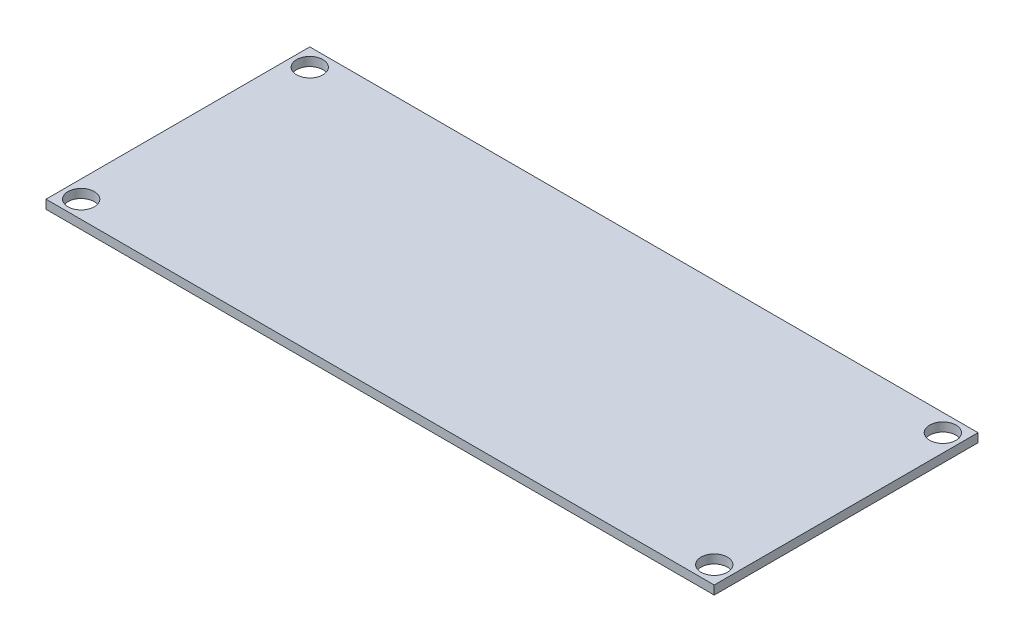
ISO-10303-21;
HEADER;
FILE_DESCRIPTION(('STEP AP214'),'2;1');
FILE_NAME('part.step','',(''),(''),'','','');
FILE_SCHEMA(('AUTOMOTIVE_DESIGN { 1 0 10303 214 1 1 1 1 }'));
ENDSEC;
DATA;
#1=APPLICATION_CONTEXT('core data for automotive mechanical design processes');
#2=APPLICATION_PROTOCOL_DEFINITION('international standard','automotive_design',2000,#1);
#3=PRODUCT_CONTEXT('',#1,'mechanical');
#4=PRODUCT('Part','Part','',(#3));
#5=PRODUCT_RELATED_PRODUCT_CATEGORY('part','',(#4));
#6=PRODUCT_DEFINITION_FORMATION('','',#4);
#7=PRODUCT_DEFINITION_CONTEXT('part definition',#1,'design');
#8=PRODUCT_DEFINITION('design','',#6,#7);
#9=PRODUCT_DEFINITION_SHAPE('','',#8);
#10=(LENGTH_UNIT() NAMED_UNIT(*) SI_UNIT(.MILLI.,.METRE.));
#11=(NAMED_UNIT(*) PLANE_ANGLE_UNIT() SI_UNIT($,.RADIAN.));
#12=(NAMED_UNIT(*) SI_UNIT($,.STERADIAN.) SOLID_ANGLE_UNIT());
#13=UNCERTAINTY_MEASURE_WITH_UNIT(LENGTH_MEASURE(1.E-05),#10,'distance_accuracy_value','');
#14=(GEOMETRIC_REPRESENTATION_CONTEXT(3) GLOBAL_UNCERTAINTY_ASSIGNED_CONTEXT((#13)) GLOBAL_UNIT_ASSIGNED_CONTEXT((#10,
#11,#12)) REPRESENTATION_CONTEXT('',''));
#15=CARTESIAN_POINT('',(0.,0.,0.));
#16=DIRECTION('',(0.,0.,1.));
#17=DIRECTION('',(1.,0.,0.));
#18=AXIS2_PLACEMENT_3D('',#15,#16,#17);
#19=CARTESIAN_POINT('',(0.,1.,0.));
#20=DIRECTION('',(0.,-1.,0.));
#21=DIRECTION('',(0.,0.,-1.));
#22=AXIS2_PLACEMENT_3D('',#19,#20,#21);
#23=PLANE('',#22);
#24=CARTESIAN_POINT('',(36.,1.,-13.));
#25=DIRECTION('',(0.,1.,0.));
#26=DIRECTION('',(0.,0.,1.));
#27=AXIS2_PLACEMENT_3D('',#24,#25,#26);
#28=CIRCLE('',#27,1.49999999999999);
#29=CARTESIAN_POINT('',(36.,1.,-11.5));
#30=VERTEX_POINT('',#29);
#31=EDGE_CURVE('E132',#30,#30,#28,.T.);
#32=ORIENTED_EDGE('',*,*,#31,.F.);
#33=EDGE_LOOP('',(#32));
#34=FACE_BOUND('',#33,.T.);
#35=CARTESIAN_POINT('',(-36.,1.,13.));
#36=DIRECTION('',(0.,1.,0.));
#37=DIRECTION('',(0.,0.,1.));
#38=AXIS2_PLACEMENT_3D('',#35,#36,#37);
#39=CIRCLE('',#38,1.49999999999999);
#40=CARTESIAN_POINT('',(-36.,1.,14.5));
#41=VERTEX_POINT('',#40);
#42=EDGE_CURVE('E120',#41,#41,#39,.T.);
#43=ORIENTED_EDGE('',*,*,#42,.F.);
#44=EDGE_LOOP('',(#43));
#45=FACE_BOUND('',#44,.T.);
#46=DIRECTION('',(0.,0.,-1.));
#47=VECTOR('',#46,1.);
#48=CARTESIAN_POINT('',(38.,1.,15.));
#49=LINE('',#48,#47);
#50=CARTESIAN_POINT('',(38.,1.,15.));
#51=VERTEX_POINT('',#50);
#52=CARTESIAN_POINT('',(38.,1.,-15.));
#53=VERTEX_POINT('',#52);
#54=EDGE_CURVE('E92',#51,#53,#49,.T.);
#55=ORIENTED_EDGE('',*,*,#54,.T.);
#56=DIRECTION('',(-1.,0.,0.));
#57=VECTOR('',#56,1.);
#58=CARTESIAN_POINT('',(-38.,1.,-15.));
#59=LINE('',#58,#57);
#60=CARTESIAN_POINT('',(-38.,1.,-15.));
#61=VERTEX_POINT('',#60);
#62=EDGE_CURVE('E87',#53,#61,#59,.T.);
#63=ORIENTED_EDGE('',*,*,#62,.T.);
#64=DIRECTION('',(0.,0.,1.));
#65=VECTOR('',#64,1.);
#66=CARTESIAN_POINT('',(-38.,1.,15.));
#67=LINE('',#66,#65);
#68=CARTESIAN_POINT('',(-38.,1.,15.));
#69=VERTEX_POINT('',#68);
#70=EDGE_CURVE('E90',#61,#69,#67,.T.);
#71=ORIENTED_EDGE('',*,*,#70,.T.);
#72=DIRECTION('',(1.,0.,0.));
#73=VECTOR('',#72,1.);
#74=CARTESIAN_POINT('',(-38.,1.,15.));
#75=LINE('',#74,#73);
#76=EDGE_CURVE('E57',#69,#51,#75,.T.);
#77=ORIENTED_EDGE('',*,*,#76,.T.);
#78=EDGE_LOOP('',(#55,#63,#71,#77));
#79=FACE_BOUND('',#78,.T.);
#80=CARTESIAN_POINT('',(36.,1.,13.));
#81=DIRECTION('',(0.,1.,0.));
#82=DIRECTION('',(0.,0.,1.));
#83=AXIS2_PLACEMENT_3D('',#80,#81,#82);
#84=CIRCLE('',#83,1.49999999999999);
#85=CARTESIAN_POINT('',(36.,1.,14.5));
#86=VERTEX_POINT('',#85);
#87=EDGE_CURVE('E126',#86,#86,#84,.T.);
#88=ORIENTED_EDGE('',*,*,#87,.F.);
#89=EDGE_LOOP('',(#88));
#90=FACE_BOUND('',#89,.T.);
#91=CARTESIAN_POINT('',(-36.,1.,-13.));
#92=DIRECTION('',(0.,1.,0.));
#93=DIRECTION('',(0.,0.,1.));
#94=AXIS2_PLACEMENT_3D('',#91,#92,#93);
#95=CIRCLE('',#94,1.49999999999999);
#96=CARTESIAN_POINT('',(-36.,1.,-11.5));
#97=VERTEX_POINT('',#96);
#98=EDGE_CURVE('E138',#97,#97,#95,.T.);
#99=ORIENTED_EDGE('',*,*,#98,.F.);
#100=EDGE_LOOP('',(#99));
#101=FACE_BOUND('',#100,.T.);
#102=ADVANCED_FACE('F40',(#34,#45,#79,#90,#101),#23,.F.);
#103=CARTESIAN_POINT('',(38.,1.,15.));
#104=DIRECTION('',(-1.,0.,0.));
#105=DIRECTION('',(0.,0.,1.));
#106=AXIS2_PLACEMENT_3D('',#103,#104,#105);
#107=PLANE('',#106);
#108=DIRECTION('',(0.,0.,-1.));
#109=VECTOR('',#108,1.);
#110=CARTESIAN_POINT('',(38.,0.,15.));
#111=LINE('',#110,#109);
#112=CARTESIAN_POINT('',(38.,0.,15.));
#113=VERTEX_POINT('',#112);
#114=CARTESIAN_POINT('',(38.,0.,-15.));
#115=VERTEX_POINT('',#114);
#116=EDGE_CURVE('E104',#113,#115,#111,.T.);
#117=ORIENTED_EDGE('',*,*,#116,.T.);
#118=DIRECTION('',(0.,-1.,0.));
#119=VECTOR('',#118,1.);
#120=CARTESIAN_POINT('',(38.,1.,-15.));
#121=LINE('',#120,#119);
#122=EDGE_CURVE('E11',#53,#115,#121,.T.);
#123=ORIENTED_EDGE('',*,*,#122,.F.);
#124=ORIENTED_EDGE('',*,*,#54,.F.);
#125=DIRECTION('',(0.,-1.,0.));
#126=VECTOR('',#125,1.);
#127=CARTESIAN_POINT('',(38.,1.,15.));
#128=LINE('',#127,#126);
#129=EDGE_CURVE('E100',#51,#113,#128,.T.);
#130=ORIENTED_EDGE('',*,*,#129,.T.);
#131=EDGE_LOOP('',(#117,#123,#124,#130));
#132=FACE_BOUND('',#131,.T.);
#133=ADVANCED_FACE('F42',(#132),#107,.F.);
#134=CARTESIAN_POINT('',(-38.,1.,-15.));
#135=DIRECTION('',(0.,0.,1.));
#136=DIRECTION('',(1.,0.,0.));
#137=AXIS2_PLACEMENT_3D('',#134,#135,#136);
#138=PLANE('',#137);
#139=DIRECTION('',(-1.,0.,0.));
#140=VECTOR('',#139,1.);
#141=CARTESIAN_POINT('',(-38.,0.,-15.));
#142=LINE('',#141,#140);
#143=CARTESIAN_POINT('',(-38.,0.,-15.));
#144=VERTEX_POINT('',#143);
#145=EDGE_CURVE('E96',#115,#144,#142,.T.);
#146=ORIENTED_EDGE('',*,*,#145,.T.);
#147=DIRECTION('',(0.,-1.,0.));
#148=VECTOR('',#147,1.);
#149=CARTESIAN_POINT('',(-38.,1.,-15.));
#150=LINE('',#149,#148);
#151=EDGE_CURVE('E49',#61,#144,#150,.T.);
#152=ORIENTED_EDGE('',*,*,#151,.F.);
#153=ORIENTED_EDGE('',*,*,#62,.F.);
#154=ORIENTED_EDGE('',*,*,#122,.T.);
#155=EDGE_LOOP('',(#146,#152,#153,#154));
#156=FACE_BOUND('',#155,.T.);
#157=ADVANCED_FACE('F95',(#156),#138,.F.);
#158=CARTESIAN_POINT('',(-38.,1.,15.));
#159=DIRECTION('',(1.,0.,0.));
#160=DIRECTION('',(0.,0.,-1.));
#161=AXIS2_PLACEMENT_3D('',#158,#159,#160);
#162=PLANE('',#161);
#163=DIRECTION('',(0.,0.,1.));
#164=VECTOR('',#163,1.);
#165=CARTESIAN_POINT('',(-38.,0.,15.));
#166=LINE('',#165,#164);
#167=CARTESIAN_POINT('',(-38.,0.,15.));
#168=VERTEX_POINT('',#167);
#169=EDGE_CURVE('E74',#144,#168,#166,.T.);
#170=ORIENTED_EDGE('',*,*,#169,.T.);
#171=DIRECTION('',(0.,-1.,0.));
#172=VECTOR('',#171,1.);
#173=CARTESIAN_POINT('',(-38.,1.,15.));
#174=LINE('',#173,#172);
#175=EDGE_CURVE('E97',#69,#168,#174,.T.);
#176=ORIENTED_EDGE('',*,*,#175,.F.);
#177=ORIENTED_EDGE('',*,*,#70,.F.);
#178=ORIENTED_EDGE('',*,*,#151,.T.);
#179=EDGE_LOOP('',(#170,#176,#177,#178));
#180=FACE_BOUND('',#179,.T.);
#181=ADVANCED_FACE('F98',(#180),#162,.F.);
#182=CARTESIAN_POINT('',(-38.,1.,15.));
#183=DIRECTION('',(0.,0.,-1.));
#184=DIRECTION('',(-1.,0.,0.));
#185=AXIS2_PLACEMENT_3D('',#182,#183,#184);
#186=PLANE('',#185);
#187=DIRECTION('',(1.,0.,0.));
#188=VECTOR('',#187,1.);
#189=CARTESIAN_POINT('',(-38.,0.,15.));
#190=LINE('',#189,#188);
#191=EDGE_CURVE('E80',#168,#113,#190,.T.);
#192=ORIENTED_EDGE('',*,*,#191,.T.);
#193=ORIENTED_EDGE('',*,*,#129,.F.);
#194=ORIENTED_EDGE('',*,*,#76,.F.);
#195=ORIENTED_EDGE('',*,*,#175,.T.);
#196=EDGE_LOOP('',(#192,#193,#194,#195));
#197=FACE_BOUND('',#196,.T.);
#198=ADVANCED_FACE('F112',(#197),#186,.F.);
#199=CARTESIAN_POINT('',(0.,0.,0.));
#200=DIRECTION('',(0.,-1.,0.));
#201=DIRECTION('',(0.,0.,-1.));
#202=AXIS2_PLACEMENT_3D('',#199,#200,#201);
#203=PLANE('',#202);
#204=CARTESIAN_POINT('',(-36.,0.,-13.));
#205=DIRECTION('',(0.,-1.,0.));
#206=DIRECTION('',(0.,0.,-1.));
#207=AXIS2_PLACEMENT_3D('',#204,#205,#206);
#208=CIRCLE('',#207,1.5);
#209=CARTESIAN_POINT('',(-36.,0.,-14.5));
#210=VERTEX_POINT('',#209);
#211=EDGE_CURVE('E135',#210,#210,#208,.T.);
#212=ORIENTED_EDGE('',*,*,#211,.F.);
#213=EDGE_LOOP('',(#212));
#214=FACE_BOUND('',#213,.T.);
#215=CARTESIAN_POINT('',(36.,0.,-13.));
#216=DIRECTION('',(0.,-1.,0.));
#217=DIRECTION('',(0.,0.,-1.));
#218=AXIS2_PLACEMENT_3D('',#215,#216,#217);
#219=CIRCLE('',#218,1.5);
#220=CARTESIAN_POINT('',(36.,0.,-14.5));
#221=VERTEX_POINT('',#220);
#222=EDGE_CURVE('E129',#221,#221,#219,.T.);
#223=ORIENTED_EDGE('',*,*,#222,.F.);
#224=EDGE_LOOP('',(#223));
#225=FACE_BOUND('',#224,.T.);
#226=CARTESIAN_POINT('',(36.,0.,13.));
#227=DIRECTION('',(0.,-1.,0.));
#228=DIRECTION('',(0.,0.,-1.));
#229=AXIS2_PLACEMENT_3D('',#226,#227,#228);
#230=CIRCLE('',#229,1.5);
#231=CARTESIAN_POINT('',(36.,0.,11.5));
#232=VERTEX_POINT('',#231);
#233=EDGE_CURVE('E123',#232,#232,#230,.T.);
#234=ORIENTED_EDGE('',*,*,#233,.F.);
#235=EDGE_LOOP('',(#234));
#236=FACE_BOUND('',#235,.T.);
#237=CARTESIAN_POINT('',(-36.,0.,13.));
#238=DIRECTION('',(0.,-1.,0.));
#239=DIRECTION('',(0.,0.,-1.));
#240=AXIS2_PLACEMENT_3D('',#237,#238,#239);
#241=CIRCLE('',#240,1.5);
#242=CARTESIAN_POINT('',(-36.,0.,11.5));
#243=VERTEX_POINT('',#242);
#244=EDGE_CURVE('E107',#243,#243,#241,.T.);
#245=ORIENTED_EDGE('',*,*,#244,.F.);
#246=EDGE_LOOP('',(#245));
#247=FACE_BOUND('',#246,.T.);
#248=ORIENTED_EDGE('',*,*,#116,.F.);
#249=ORIENTED_EDGE('',*,*,#191,.F.);
#250=ORIENTED_EDGE('',*,*,#169,.F.);
#251=ORIENTED_EDGE('',*,*,#145,.F.);
#252=EDGE_LOOP('',(#248,#249,#250,#251));
#253=FACE_BOUND('',#252,.T.);
#254=ADVANCED_FACE('F115',(#214,#225,#236,#247,#253),#203,.T.);
#255=CARTESIAN_POINT('',(-36.,1.,13.));
#256=DIRECTION('',(0.,1.,0.));
#257=DIRECTION('',(0.,0.,1.));
#258=AXIS2_PLACEMENT_3D('',#255,#256,#257);
#259=CYLINDRICAL_SURFACE('',#258,1.5);
#260=ORIENTED_EDGE('',*,*,#42,.T.);
#261=EDGE_LOOP('',(#260));
#262=FACE_BOUND('',#261,.T.);
#263=ORIENTED_EDGE('',*,*,#244,.T.);
#264=EDGE_LOOP('',(#263));
#265=FACE_BOUND('',#264,.T.);
#266=ADVANCED_FACE('F155',(#262,#265),#259,.F.);
#267=CARTESIAN_POINT('',(36.,1.,13.));
#268=DIRECTION('',(0.,1.,0.));
#269=DIRECTION('',(0.,0.,1.));
#270=AXIS2_PLACEMENT_3D('',#267,#268,#269);
#271=CYLINDRICAL_SURFACE('',#270,1.5);
#272=ORIENTED_EDGE('',*,*,#87,.T.);
#273=EDGE_LOOP('',(#272));
#274=FACE_BOUND('',#273,.T.);
#275=ORIENTED_EDGE('',*,*,#233,.T.);
#276=EDGE_LOOP('',(#275));
#277=FACE_BOUND('',#276,.T.);
#278=ADVANCED_FACE('F186',(#274,#277),#271,.F.);
#279=CARTESIAN_POINT('',(36.,1.,-13.));
#280=DIRECTION('',(0.,1.,0.));
#281=DIRECTION('',(0.,0.,1.));
#282=AXIS2_PLACEMENT_3D('',#279,#280,#281);
#283=CYLINDRICAL_SURFACE('',#282,1.5);
#284=ORIENTED_EDGE('',*,*,#31,.T.);
#285=EDGE_LOOP('',(#284));
#286=FACE_BOUND('',#285,.T.);
#287=ORIENTED_EDGE('',*,*,#222,.T.);
#288=EDGE_LOOP('',(#287));
#289=FACE_BOUND('',#288,.T.);
#290=ADVANCED_FACE('F193',(#286,#289),#283,.F.);
#291=CARTESIAN_POINT('',(-36.,1.,-13.));
#292=DIRECTION('',(0.,1.,0.));
#293=DIRECTION('',(0.,0.,1.));
#294=AXIS2_PLACEMENT_3D('',#291,#292,#293);
#295=CYLINDRICAL_SURFACE('',#294,1.5);
#296=ORIENTED_EDGE('',*,*,#98,.T.);
#297=EDGE_LOOP('',(#296));
#298=FACE_BOUND('',#297,.T.);
#299=ORIENTED_EDGE('',*,*,#211,.T.);
#300=EDGE_LOOP('',(#299));
#301=FACE_BOUND('',#300,.T.);
#302=ADVANCED_FACE('F142',(#298,#301),#295,.F.);
#303=CLOSED_SHELL('',(#102,#133,#157,#181,#198,#254,#266,#278,#290,#302));
#304=MANIFOLD_SOLID_BREP('B2',#303);
#305=ADVANCED_BREP_SHAPE_REPRESENTATION('',(#18,#304),#14);
#306=SHAPE_DEFINITION_REPRESENTATION(#9,#305);
ENDSEC;
END-ISO-10303-21;
